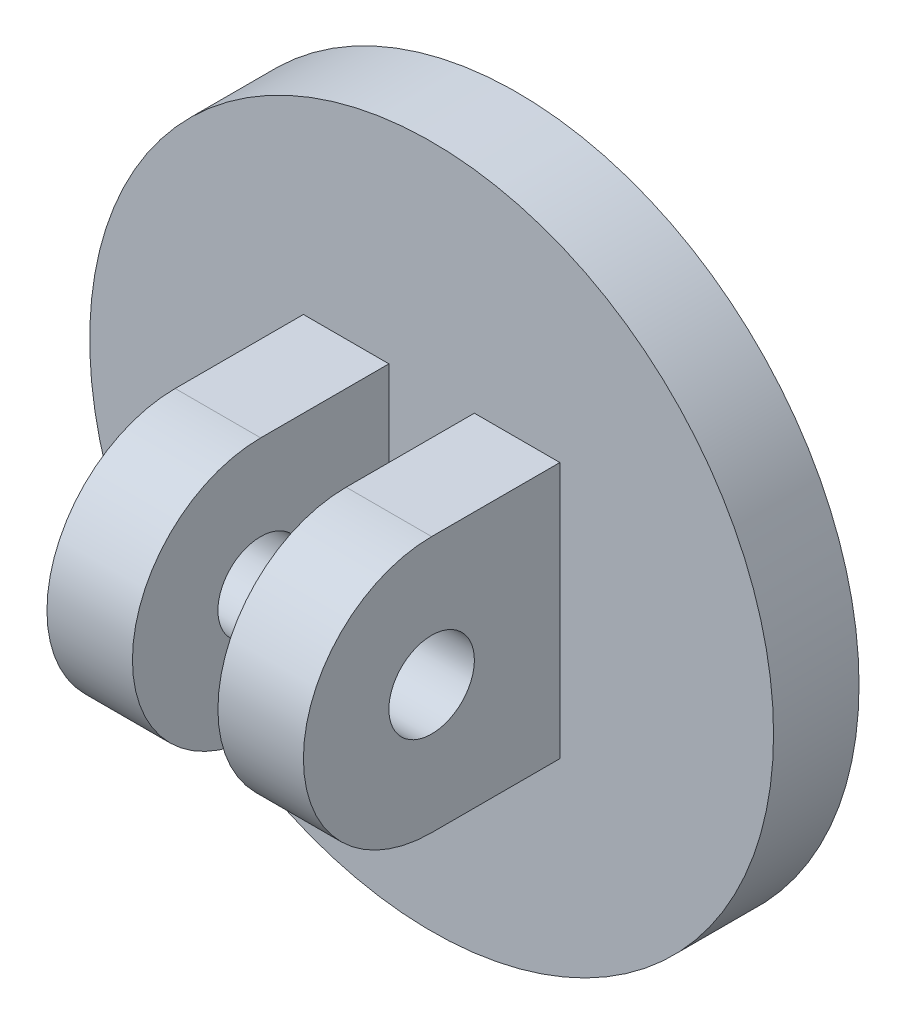
ISO-10303-21;
HEADER;
FILE_DESCRIPTION(('STEP AP214'),'2;1');
FILE_NAME('part.step','',(''),(''),'','','');
FILE_SCHEMA(('AUTOMOTIVE_DESIGN { 1 0 10303 214 1 1 1 1 }'));
ENDSEC;
DATA;
#1=APPLICATION_CONTEXT('core data for automotive mechanical design processes');
#2=APPLICATION_PROTOCOL_DEFINITION('international standard','automotive_design',2000,#1);
#3=PRODUCT_CONTEXT('',#1,'mechanical');
#4=PRODUCT('Part','Part','',(#3));
#5=PRODUCT_RELATED_PRODUCT_CATEGORY('part','',(#4));
#6=PRODUCT_DEFINITION_FORMATION('','',#4);
#7=PRODUCT_DEFINITION_CONTEXT('part definition',#1,'design');
#8=PRODUCT_DEFINITION('design','',#6,#7);
#9=PRODUCT_DEFINITION_SHAPE('','',#8);
#10=(LENGTH_UNIT() NAMED_UNIT(*) SI_UNIT(.MILLI.,.METRE.));
#11=(NAMED_UNIT(*) PLANE_ANGLE_UNIT() SI_UNIT($,.RADIAN.));
#12=(NAMED_UNIT(*) SI_UNIT($,.STERADIAN.) SOLID_ANGLE_UNIT());
#13=UNCERTAINTY_MEASURE_WITH_UNIT(LENGTH_MEASURE(1.E-05),#10,'distance_accuracy_value','');
#14=(GEOMETRIC_REPRESENTATION_CONTEXT(3) GLOBAL_UNCERTAINTY_ASSIGNED_CONTEXT((#13)) GLOBAL_UNIT_ASSIGNED_CONTEXT((#10,
#11,#12)) REPRESENTATION_CONTEXT('',''));
#15=CARTESIAN_POINT('',(0.,0.,0.));
#16=DIRECTION('',(0.,0.,1.));
#17=DIRECTION('',(1.,0.,0.));
#18=AXIS2_PLACEMENT_3D('',#15,#16,#17);
#19=CARTESIAN_POINT('',(0.,0.,5.));
#20=DIRECTION('',(0.,0.,1.));
#21=DIRECTION('',(1.,0.,0.));
#22=AXIS2_PLACEMENT_3D('',#19,#20,#21);
#23=PLANE('',#22);
#24=CARTESIAN_POINT('',(0.,0.,5.));
#25=DIRECTION('',(0.,0.,1.));
#26=DIRECTION('',(1.,0.,0.));
#27=AXIS2_PLACEMENT_3D('',#24,#25,#26);
#28=CIRCLE('',#27,20.);
#29=CARTESIAN_POINT('',(20.,0.,5.));
#30=VERTEX_POINT('',#29);
#31=EDGE_CURVE('E83',#30,#30,#28,.T.);
#32=ORIENTED_EDGE('',*,*,#31,.T.);
#33=EDGE_LOOP('',(#32));
#34=FACE_BOUND('',#33,.T.);
#35=CARTESIAN_POINT('',(0.,0.,5.));
#36=DIRECTION('',(0.,0.,1.));
#37=DIRECTION('',(1.,0.,0.));
#38=AXIS2_PLACEMENT_3D('',#35,#36,#37);
#39=CIRCLE('',#38,2.5);
#40=CARTESIAN_POINT('',(-2.5,0.,5.));
#41=VERTEX_POINT('',#40);
#42=CARTESIAN_POINT('',(2.5,0.,5.));
#43=VERTEX_POINT('',#42);
#44=EDGE_CURVE('E215',#41,#43,#39,.T.);
#45=ORIENTED_EDGE('',*,*,#44,.F.);
#46=DIRECTION('',(0.,-1.,0.));
#47=VECTOR('',#46,1.);
#48=CARTESIAN_POINT('',(-2.5,-7.5,5.));
#49=LINE('',#48,#47);
#50=CARTESIAN_POINT('',(-2.5,-7.5,5.));
#51=VERTEX_POINT('',#50);
#52=EDGE_CURVE('E182',#41,#51,#49,.T.);
#53=ORIENTED_EDGE('',*,*,#52,.T.);
#54=DIRECTION('',(-1.,0.,0.));
#55=VECTOR('',#54,1.);
#56=CARTESIAN_POINT('',(-2.5,-7.5,5.));
#57=LINE('',#56,#55);
#58=CARTESIAN_POINT('',(-7.5,-7.5,5.));
#59=VERTEX_POINT('',#58);
#60=EDGE_CURVE('E301',#51,#59,#57,.T.);
#61=ORIENTED_EDGE('',*,*,#60,.T.);
#62=DIRECTION('',(0.,1.,0.));
#63=VECTOR('',#62,1.);
#64=CARTESIAN_POINT('',(-7.5,-7.5,5.));
#65=LINE('',#64,#63);
#66=CARTESIAN_POINT('',(-7.5,7.5,5.));
#67=VERTEX_POINT('',#66);
#68=EDGE_CURVE('E304',#59,#67,#65,.T.);
#69=ORIENTED_EDGE('',*,*,#68,.T.);
#70=DIRECTION('',(1.,0.,0.));
#71=VECTOR('',#70,1.);
#72=CARTESIAN_POINT('',(-2.5,7.5,5.));
#73=LINE('',#72,#71);
#74=CARTESIAN_POINT('',(-2.5,7.5,5.));
#75=VERTEX_POINT('',#74);
#76=EDGE_CURVE('E172',#67,#75,#73,.T.);
#77=ORIENTED_EDGE('',*,*,#76,.T.);
#78=EDGE_CURVE('E92',#75,#41,#49,.T.);
#79=ORIENTED_EDGE('',*,*,#78,.T.);
#80=EDGE_CURVE('E219',#43,#41,#39,.T.);
#81=ORIENTED_EDGE('',*,*,#80,.F.);
#82=DIRECTION('',(0.,-1.,0.));
#83=VECTOR('',#82,1.);
#84=CARTESIAN_POINT('',(2.5,-7.5,5.));
#85=LINE('',#84,#83);
#86=CARTESIAN_POINT('',(2.5,7.5,5.));
#87=VERTEX_POINT('',#86);
#88=EDGE_CURVE('E85',#87,#43,#85,.T.);
#89=ORIENTED_EDGE('',*,*,#88,.F.);
#90=DIRECTION('',(-1.,0.,0.));
#91=VECTOR('',#90,1.);
#92=CARTESIAN_POINT('',(2.5,7.5,5.));
#93=LINE('',#92,#91);
#94=CARTESIAN_POINT('',(7.5,7.5,5.));
#95=VERTEX_POINT('',#94);
#96=EDGE_CURVE('E205',#95,#87,#93,.T.);
#97=ORIENTED_EDGE('',*,*,#96,.F.);
#98=DIRECTION('',(0.,1.,0.));
#99=VECTOR('',#98,1.);
#100=CARTESIAN_POINT('',(7.5,-7.5,5.));
#101=LINE('',#100,#99);
#102=CARTESIAN_POINT('',(7.5,-7.5,5.));
#103=VERTEX_POINT('',#102);
#104=EDGE_CURVE('E202',#103,#95,#101,.T.);
#105=ORIENTED_EDGE('',*,*,#104,.F.);
#106=DIRECTION('',(1.,0.,0.));
#107=VECTOR('',#106,1.);
#108=CARTESIAN_POINT('',(2.5,-7.5,5.));
#109=LINE('',#108,#107);
#110=CARTESIAN_POINT('',(2.5,-7.5,5.));
#111=VERTEX_POINT('',#110);
#112=EDGE_CURVE('E199',#111,#103,#109,.T.);
#113=ORIENTED_EDGE('',*,*,#112,.F.);
#114=EDGE_CURVE('E12',#43,#111,#85,.T.);
#115=ORIENTED_EDGE('',*,*,#114,.F.);
#116=EDGE_LOOP('',(#45,#53,#61,#69,#77,#79,#81,#89,#97,#105,#113,#115));
#117=FACE_BOUND('',#116,.T.);
#118=ADVANCED_FACE('F74',(#34,#117),#23,.T.);
#119=CARTESIAN_POINT('',(2.5,-7.5,20.));
#120=DIRECTION('',(1.,0.,0.));
#121=DIRECTION('',(0.,0.,-1.));
#122=AXIS2_PLACEMENT_3D('',#119,#120,#121);
#123=PLANE('',#122);
#124=CARTESIAN_POINT('',(2.5,0.,12.5));
#125=DIRECTION('',(1.,0.,0.));
#126=DIRECTION('',(0.,1.,0.));
#127=AXIS2_PLACEMENT_3D('',#124,#125,#126);
#128=CIRCLE('',#127,2.5);
#129=CARTESIAN_POINT('',(2.5,2.5,12.5));
#130=VERTEX_POINT('',#129);
#131=EDGE_CURVE('E186',#130,#130,#128,.T.);
#132=ORIENTED_EDGE('',*,*,#131,.T.);
#133=EDGE_LOOP('',(#132));
#134=FACE_BOUND('',#133,.T.);
#135=CARTESIAN_POINT('',(2.5,0.,12.5));
#136=DIRECTION('',(1.,0.,0.));
#137=DIRECTION('',(0.,1.,0.));
#138=AXIS2_PLACEMENT_3D('',#135,#136,#137);
#139=CIRCLE('',#138,7.5);
#140=CARTESIAN_POINT('',(2.5,7.5,12.5));
#141=VERTEX_POINT('',#140);
#142=CARTESIAN_POINT('',(2.5,-7.5,12.5));
#143=VERTEX_POINT('',#142);
#144=EDGE_CURVE('E193',#141,#143,#139,.T.);
#145=ORIENTED_EDGE('',*,*,#144,.F.);
#146=DIRECTION('',(0.,0.,-1.));
#147=VECTOR('',#146,1.);
#148=CARTESIAN_POINT('',(2.5,7.5,20.));
#149=LINE('',#148,#147);
#150=EDGE_CURVE('E100',#141,#87,#149,.T.);
#151=ORIENTED_EDGE('',*,*,#150,.T.);
#152=ORIENTED_EDGE('',*,*,#88,.T.);
#153=ORIENTED_EDGE('',*,*,#114,.T.);
#154=DIRECTION('',(0.,0.,-1.));
#155=VECTOR('',#154,1.);
#156=CARTESIAN_POINT('',(2.5,-7.5,20.));
#157=LINE('',#156,#155);
#158=EDGE_CURVE('E213',#143,#111,#157,.T.);
#159=ORIENTED_EDGE('',*,*,#158,.F.);
#160=EDGE_LOOP('',(#145,#151,#152,#153,#159));
#161=FACE_BOUND('',#160,.T.);
#162=ADVANCED_FACE('F243',(#134,#161),#123,.F.);
#163=CARTESIAN_POINT('',(7.5,-7.5,20.));
#164=DIRECTION('',(-1.,0.,0.));
#165=DIRECTION('',(0.,-1.,0.));
#166=AXIS2_PLACEMENT_3D('',#163,#164,#165);
#167=PLANE('',#166);
#168=CARTESIAN_POINT('',(7.5,0.,12.5));
#169=DIRECTION('',(1.,0.,0.));
#170=DIRECTION('',(0.,1.,0.));
#171=AXIS2_PLACEMENT_3D('',#168,#169,#170);
#172=CIRCLE('',#171,2.5);
#173=CARTESIAN_POINT('',(7.5,2.5,12.5));
#174=VERTEX_POINT('',#173);
#175=EDGE_CURVE('E187',#174,#174,#172,.T.);
#176=ORIENTED_EDGE('',*,*,#175,.F.);
#177=EDGE_LOOP('',(#176));
#178=FACE_BOUND('',#177,.T.);
#179=DIRECTION('',(0.,0.,-1.));
#180=VECTOR('',#179,1.);
#181=CARTESIAN_POINT('',(7.5,7.5,20.));
#182=LINE('',#181,#180);
#183=CARTESIAN_POINT('',(7.5,7.5,12.5));
#184=VERTEX_POINT('',#183);
#185=EDGE_CURVE('E209',#184,#95,#182,.T.);
#186=ORIENTED_EDGE('',*,*,#185,.F.);
#187=CARTESIAN_POINT('',(7.5,0.,12.5));
#188=DIRECTION('',(1.,0.,0.));
#189=DIRECTION('',(0.,1.,0.));
#190=AXIS2_PLACEMENT_3D('',#187,#188,#189);
#191=CIRCLE('',#190,7.5);
#192=CARTESIAN_POINT('',(7.5,-7.5,12.5));
#193=VERTEX_POINT('',#192);
#194=EDGE_CURVE('E190',#184,#193,#191,.T.);
#195=ORIENTED_EDGE('',*,*,#194,.T.);
#196=DIRECTION('',(0.,0.,-1.));
#197=VECTOR('',#196,1.);
#198=CARTESIAN_POINT('',(7.5,-7.5,20.));
#199=LINE('',#198,#197);
#200=EDGE_CURVE('E211',#193,#103,#199,.T.);
#201=ORIENTED_EDGE('',*,*,#200,.T.);
#202=ORIENTED_EDGE('',*,*,#104,.T.);
#203=EDGE_LOOP('',(#186,#195,#201,#202));
#204=FACE_BOUND('',#203,.T.);
#205=ADVANCED_FACE('F247',(#178,#204),#167,.F.);
#206=CARTESIAN_POINT('',(2.5,-7.5,20.));
#207=DIRECTION('',(0.,1.,0.));
#208=DIRECTION('',(-1.,0.,0.));
#209=AXIS2_PLACEMENT_3D('',#206,#207,#208);
#210=PLANE('',#209);
#211=DIRECTION('',(1.,0.,0.));
#212=VECTOR('',#211,1.);
#213=CARTESIAN_POINT('',(2.5,-7.5,12.5));
#214=LINE('',#213,#212);
#215=EDGE_CURVE('E195',#143,#193,#214,.T.);
#216=ORIENTED_EDGE('',*,*,#215,.F.);
#217=ORIENTED_EDGE('',*,*,#158,.T.);
#218=ORIENTED_EDGE('',*,*,#112,.T.);
#219=ORIENTED_EDGE('',*,*,#200,.F.);
#220=EDGE_LOOP('',(#216,#217,#218,#219));
#221=FACE_BOUND('',#220,.T.);
#222=ADVANCED_FACE('F239',(#221),#210,.F.);
#223=CARTESIAN_POINT('',(0.,0.,5.));
#224=DIRECTION('',(0.,0.,-1.));
#225=DIRECTION('',(-1.,0.,0.));
#226=AXIS2_PLACEMENT_3D('',#223,#224,#225);
#227=CYLINDRICAL_SURFACE('',#226,20.);
#228=ORIENTED_EDGE('',*,*,#31,.F.);
#229=EDGE_LOOP('',(#228));
#230=FACE_BOUND('',#229,.T.);
#231=CARTESIAN_POINT('',(0.,0.,0.));
#232=DIRECTION('',(0.,0.,1.));
#233=DIRECTION('',(1.,0.,0.));
#234=AXIS2_PLACEMENT_3D('',#231,#232,#233);
#235=CIRCLE('',#234,20.);
#236=CARTESIAN_POINT('',(20.,0.,0.));
#237=VERTEX_POINT('',#236);
#238=EDGE_CURVE('E78',#237,#237,#235,.T.);
#239=ORIENTED_EDGE('',*,*,#238,.T.);
#240=EDGE_LOOP('',(#239));
#241=FACE_BOUND('',#240,.T.);
#242=ADVANCED_FACE('F76',(#230,#241),#227,.T.);
#243=CARTESIAN_POINT('',(0.,0.,0.));
#244=DIRECTION('',(0.,0.,1.));
#245=DIRECTION('',(1.,0.,0.));
#246=AXIS2_PLACEMENT_3D('',#243,#244,#245);
#247=PLANE('',#246);
#248=CARTESIAN_POINT('',(0.,0.,0.));
#249=DIRECTION('',(0.,0.,1.));
#250=DIRECTION('',(1.,0.,0.));
#251=AXIS2_PLACEMENT_3D('',#248,#249,#250);
#252=CIRCLE('',#251,2.5);
#253=CARTESIAN_POINT('',(2.5,0.,0.));
#254=VERTEX_POINT('',#253);
#255=EDGE_CURVE('E216',#254,#254,#252,.T.);
#256=ORIENTED_EDGE('',*,*,#255,.T.);
#257=EDGE_LOOP('',(#256));
#258=FACE_BOUND('',#257,.T.);
#259=ORIENTED_EDGE('',*,*,#238,.F.);
#260=EDGE_LOOP('',(#259));
#261=FACE_BOUND('',#260,.T.);
#262=ADVANCED_FACE('F228',(#258,#261),#247,.F.);
#263=CARTESIAN_POINT('',(0.,0.,0.));
#264=DIRECTION('',(0.,0.,1.));
#265=DIRECTION('',(1.,0.,0.));
#266=AXIS2_PLACEMENT_3D('',#263,#264,#265);
#267=CYLINDRICAL_SURFACE('',#266,2.5);
#268=ORIENTED_EDGE('',*,*,#255,.F.);
#269=EDGE_LOOP('',(#268));
#270=FACE_BOUND('',#269,.T.);
#271=ORIENTED_EDGE('',*,*,#80,.T.);
#272=ORIENTED_EDGE('',*,*,#44,.T.);
#273=EDGE_LOOP('',(#271,#272));
#274=FACE_BOUND('',#273,.T.);
#275=ADVANCED_FACE('F230',(#270,#274),#267,.F.);
#276=CARTESIAN_POINT('',(2.5,7.5,20.));
#277=DIRECTION('',(0.,-1.,0.));
#278=DIRECTION('',(1.,0.,0.));
#279=AXIS2_PLACEMENT_3D('',#276,#277,#278);
#280=PLANE('',#279);
#281=ORIENTED_EDGE('',*,*,#150,.F.);
#282=DIRECTION('',(1.,0.,0.));
#283=VECTOR('',#282,1.);
#284=CARTESIAN_POINT('',(2.5,7.5,12.5));
#285=LINE('',#284,#283);
#286=EDGE_CURVE('E183',#141,#184,#285,.T.);
#287=ORIENTED_EDGE('',*,*,#286,.T.);
#288=ORIENTED_EDGE('',*,*,#185,.T.);
#289=ORIENTED_EDGE('',*,*,#96,.T.);
#290=EDGE_LOOP('',(#281,#287,#288,#289));
#291=FACE_BOUND('',#290,.T.);
#292=ADVANCED_FACE('F236',(#291),#280,.F.);
#293=CARTESIAN_POINT('',(2.5,0.,12.5));
#294=DIRECTION('',(1.,0.,0.));
#295=DIRECTION('',(0.,1.,0.));
#296=AXIS2_PLACEMENT_3D('',#293,#294,#295);
#297=CYLINDRICAL_SURFACE('',#296,7.5);
#298=ORIENTED_EDGE('',*,*,#194,.F.);
#299=ORIENTED_EDGE('',*,*,#286,.F.);
#300=ORIENTED_EDGE('',*,*,#144,.T.);
#301=ORIENTED_EDGE('',*,*,#215,.T.);
#302=EDGE_LOOP('',(#298,#299,#300,#301));
#303=FACE_BOUND('',#302,.T.);
#304=ADVANCED_FACE('F260',(#303),#297,.T.);
#305=CARTESIAN_POINT('',(2.5,0.,12.5));
#306=DIRECTION('',(1.,0.,0.));
#307=DIRECTION('',(0.,1.,0.));
#308=AXIS2_PLACEMENT_3D('',#305,#306,#307);
#309=CYLINDRICAL_SURFACE('',#308,2.5);
#310=ORIENTED_EDGE('',*,*,#131,.F.);
#311=EDGE_LOOP('',(#310));
#312=FACE_BOUND('',#311,.T.);
#313=ORIENTED_EDGE('',*,*,#175,.T.);
#314=EDGE_LOOP('',(#313));
#315=FACE_BOUND('',#314,.T.);
#316=ADVANCED_FACE('F264',(#312,#315),#309,.F.);
#317=CARTESIAN_POINT('',(-2.5,-7.5,20.));
#318=DIRECTION('',(-1.,0.,0.));
#319=DIRECTION('',(0.,0.,-1.));
#320=AXIS2_PLACEMENT_3D('',#317,#318,#319);
#321=PLANE('',#320);
#322=CARTESIAN_POINT('',(-2.5,0.,12.5));
#323=DIRECTION('',(1.,0.,0.));
#324=DIRECTION('',(0.,1.,0.));
#325=AXIS2_PLACEMENT_3D('',#322,#323,#324);
#326=CIRCLE('',#325,2.5);
#327=CARTESIAN_POINT('',(-2.5,2.5,12.5));
#328=VERTEX_POINT('',#327);
#329=EDGE_CURVE('E159',#328,#328,#326,.T.);
#330=ORIENTED_EDGE('',*,*,#329,.F.);
#331=EDGE_LOOP('',(#330));
#332=FACE_BOUND('',#331,.T.);
#333=CARTESIAN_POINT('',(-2.5,0.,12.5));
#334=DIRECTION('',(1.,0.,0.));
#335=DIRECTION('',(0.,1.,0.));
#336=AXIS2_PLACEMENT_3D('',#333,#334,#335);
#337=CIRCLE('',#336,7.5);
#338=CARTESIAN_POINT('',(-2.5,7.5,12.5));
#339=VERTEX_POINT('',#338);
#340=CARTESIAN_POINT('',(-2.5,-7.5,12.5));
#341=VERTEX_POINT('',#340);
#342=EDGE_CURVE('E156',#339,#341,#337,.T.);
#343=ORIENTED_EDGE('',*,*,#342,.T.);
#344=DIRECTION('',(0.,0.,-1.));
#345=VECTOR('',#344,1.);
#346=CARTESIAN_POINT('',(-2.5,-7.5,20.));
#347=LINE('',#346,#345);
#348=EDGE_CURVE('E175',#341,#51,#347,.T.);
#349=ORIENTED_EDGE('',*,*,#348,.T.);
#350=ORIENTED_EDGE('',*,*,#52,.F.);
#351=ORIENTED_EDGE('',*,*,#78,.F.);
#352=DIRECTION('',(0.,0.,-1.));
#353=VECTOR('',#352,1.);
#354=CARTESIAN_POINT('',(-2.5,7.5,20.));
#355=LINE('',#354,#353);
#356=EDGE_CURVE('E173',#339,#75,#355,.T.);
#357=ORIENTED_EDGE('',*,*,#356,.F.);
#358=EDGE_LOOP('',(#343,#349,#350,#351,#357));
#359=FACE_BOUND('',#358,.T.);
#360=ADVANCED_FACE('F268',(#332,#359),#321,.F.);
#361=CARTESIAN_POINT('',(-7.5,-7.5,20.));
#362=DIRECTION('',(1.,0.,0.));
#363=DIRECTION('',(0.,-1.,0.));
#364=AXIS2_PLACEMENT_3D('',#361,#362,#363);
#365=PLANE('',#364);
#366=CARTESIAN_POINT('',(-7.5,0.,12.5));
#367=DIRECTION('',(1.,0.,0.));
#368=DIRECTION('',(0.,1.,0.));
#369=AXIS2_PLACEMENT_3D('',#366,#367,#368);
#370=CIRCLE('',#369,2.5);
#371=CARTESIAN_POINT('',(-7.5,2.5,12.5));
#372=VERTEX_POINT('',#371);
#373=EDGE_CURVE('E168',#372,#372,#370,.T.);
#374=ORIENTED_EDGE('',*,*,#373,.T.);
#375=EDGE_LOOP('',(#374));
#376=FACE_BOUND('',#375,.T.);
#377=DIRECTION('',(0.,0.,-1.));
#378=VECTOR('',#377,1.);
#379=CARTESIAN_POINT('',(-7.5,7.5,20.));
#380=LINE('',#379,#378);
#381=CARTESIAN_POINT('',(-7.5,7.5,12.5));
#382=VERTEX_POINT('',#381);
#383=EDGE_CURVE('E165',#382,#67,#380,.T.);
#384=ORIENTED_EDGE('',*,*,#383,.T.);
#385=ORIENTED_EDGE('',*,*,#68,.F.);
#386=DIRECTION('',(0.,0.,-1.));
#387=VECTOR('',#386,1.);
#388=CARTESIAN_POINT('',(-7.5,-7.5,20.));
#389=LINE('',#388,#387);
#390=CARTESIAN_POINT('',(-7.5,-7.5,12.5));
#391=VERTEX_POINT('',#390);
#392=EDGE_CURVE('E167',#391,#59,#389,.T.);
#393=ORIENTED_EDGE('',*,*,#392,.F.);
#394=CARTESIAN_POINT('',(-7.5,0.,12.5));
#395=DIRECTION('',(1.,0.,0.));
#396=DIRECTION('',(0.,1.,0.));
#397=AXIS2_PLACEMENT_3D('',#394,#395,#396);
#398=CIRCLE('',#397,7.5);
#399=EDGE_CURVE('E153',#382,#391,#398,.T.);
#400=ORIENTED_EDGE('',*,*,#399,.F.);
#401=EDGE_LOOP('',(#384,#385,#393,#400));
#402=FACE_BOUND('',#401,.T.);
#403=ADVANCED_FACE('F163',(#376,#402),#365,.F.);
#404=CARTESIAN_POINT('',(-2.5,-7.5,20.));
#405=DIRECTION('',(0.,1.,0.));
#406=DIRECTION('',(1.,0.,0.));
#407=AXIS2_PLACEMENT_3D('',#404,#405,#406);
#408=PLANE('',#407);
#409=DIRECTION('',(-1.,0.,0.));
#410=VECTOR('',#409,1.);
#411=CARTESIAN_POINT('',(-2.5,-7.5,12.5));
#412=LINE('',#411,#410);
#413=EDGE_CURVE('E297',#341,#391,#412,.T.);
#414=ORIENTED_EDGE('',*,*,#413,.T.);
#415=ORIENTED_EDGE('',*,*,#392,.T.);
#416=ORIENTED_EDGE('',*,*,#60,.F.);
#417=ORIENTED_EDGE('',*,*,#348,.F.);
#418=EDGE_LOOP('',(#414,#415,#416,#417));
#419=FACE_BOUND('',#418,.T.);
#420=ADVANCED_FACE('F273',(#419),#408,.F.);
#421=CARTESIAN_POINT('',(-2.5,7.5,20.));
#422=DIRECTION('',(0.,-1.,0.));
#423=DIRECTION('',(-1.,0.,0.));
#424=AXIS2_PLACEMENT_3D('',#421,#422,#423);
#425=PLANE('',#424);
#426=ORIENTED_EDGE('',*,*,#356,.T.);
#427=ORIENTED_EDGE('',*,*,#76,.F.);
#428=ORIENTED_EDGE('',*,*,#383,.F.);
#429=DIRECTION('',(-1.,0.,0.));
#430=VECTOR('',#429,1.);
#431=CARTESIAN_POINT('',(-2.5,7.5,12.5));
#432=LINE('',#431,#430);
#433=EDGE_CURVE('E150',#339,#382,#432,.T.);
#434=ORIENTED_EDGE('',*,*,#433,.F.);
#435=EDGE_LOOP('',(#426,#427,#428,#434));
#436=FACE_BOUND('',#435,.T.);
#437=ADVANCED_FACE('F170',(#436),#425,.F.);
#438=CARTESIAN_POINT('',(-2.5,0.,12.5));
#439=DIRECTION('',(-1.,0.,0.));
#440=DIRECTION('',(0.,1.,0.));
#441=AXIS2_PLACEMENT_3D('',#438,#439,#440);
#442=CYLINDRICAL_SURFACE('',#441,7.5);
#443=ORIENTED_EDGE('',*,*,#399,.T.);
#444=ORIENTED_EDGE('',*,*,#413,.F.);
#445=ORIENTED_EDGE('',*,*,#342,.F.);
#446=ORIENTED_EDGE('',*,*,#433,.T.);
#447=EDGE_LOOP('',(#443,#444,#445,#446));
#448=FACE_BOUND('',#447,.T.);
#449=ADVANCED_FACE('F152',(#448),#442,.T.);
#450=CARTESIAN_POINT('',(-2.5,0.,12.5));
#451=DIRECTION('',(-1.,0.,0.));
#452=DIRECTION('',(0.,1.,0.));
#453=AXIS2_PLACEMENT_3D('',#450,#451,#452);
#454=CYLINDRICAL_SURFACE('',#453,2.5);
#455=ORIENTED_EDGE('',*,*,#329,.T.);
#456=EDGE_LOOP('',(#455));
#457=FACE_BOUND('',#456,.T.);
#458=ORIENTED_EDGE('',*,*,#373,.F.);
#459=EDGE_LOOP('',(#458));
#460=FACE_BOUND('',#459,.T.);
#461=ADVANCED_FACE('F284',(#457,#460),#454,.F.);
#462=CLOSED_SHELL('',(#118,#162,#205,#222,#242,#262,#275,#292,#304,#316,#360,#403,#420,#437,
#449,#461));
#463=MANIFOLD_SOLID_BREP('B2',#462);
#464=ADVANCED_BREP_SHAPE_REPRESENTATION('',(#18,#463),#14);
#465=SHAPE_DEFINITION_REPRESENTATION(#9,#464);
ENDSEC;
END-ISO-10303-21;
